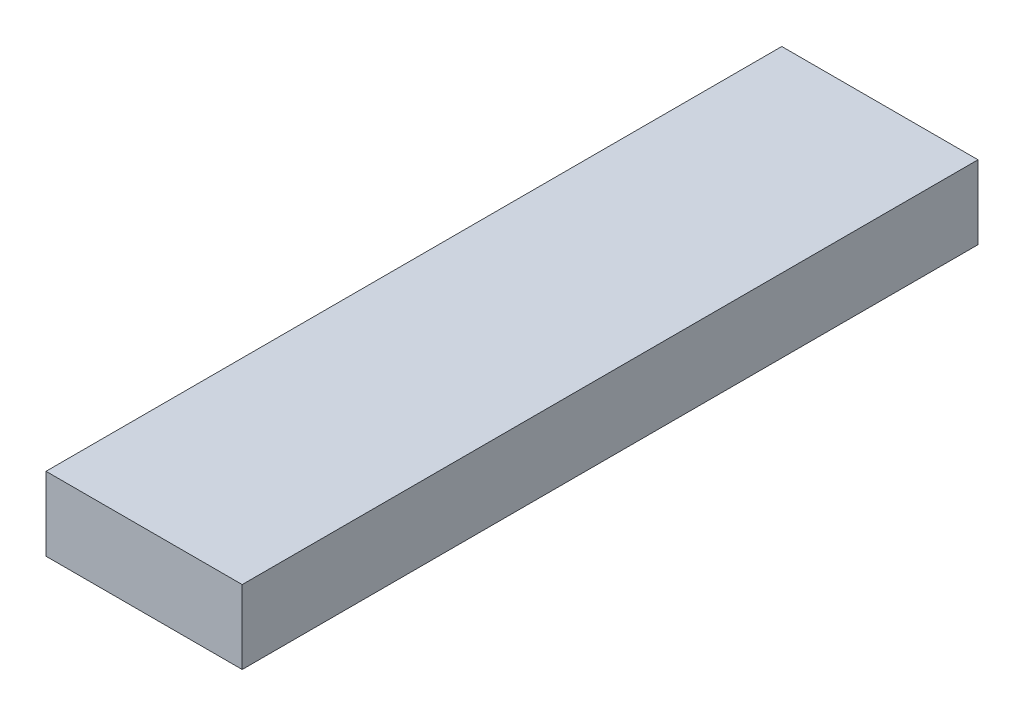
ISO-10303-21;
HEADER;
FILE_DESCRIPTION(('STEP AP214'),'2;1');
FILE_NAME('part.step','',(''),(''),'','','');
FILE_SCHEMA(('AUTOMOTIVE_DESIGN { 1 0 10303 214 1 1 1 1 }'));
ENDSEC;
DATA;
#1=APPLICATION_CONTEXT('core data for automotive mechanical design processes');
#2=APPLICATION_PROTOCOL_DEFINITION('international standard','automotive_design',2000,#1);
#3=PRODUCT_CONTEXT('',#1,'mechanical');
#4=PRODUCT('Part','Part','',(#3));
#5=PRODUCT_RELATED_PRODUCT_CATEGORY('part','',(#4));
#6=PRODUCT_DEFINITION_FORMATION('','',#4);
#7=PRODUCT_DEFINITION_CONTEXT('part definition',#1,'design');
#8=PRODUCT_DEFINITION('design','',#6,#7);
#9=PRODUCT_DEFINITION_SHAPE('','',#8);
#10=(LENGTH_UNIT() NAMED_UNIT(*) SI_UNIT(.MILLI.,.METRE.));
#11=(NAMED_UNIT(*) PLANE_ANGLE_UNIT() SI_UNIT($,.RADIAN.));
#12=(NAMED_UNIT(*) SI_UNIT($,.STERADIAN.) SOLID_ANGLE_UNIT());
#13=UNCERTAINTY_MEASURE_WITH_UNIT(LENGTH_MEASURE(1.E-05),#10,'distance_accuracy_value','');
#14=(GEOMETRIC_REPRESENTATION_CONTEXT(3) GLOBAL_UNCERTAINTY_ASSIGNED_CONTEXT((#13)) GLOBAL_UNIT_ASSIGNED_CONTEXT((#10,
#11,#12)) REPRESENTATION_CONTEXT('',''));
#15=CARTESIAN_POINT('',(0.,0.,0.));
#16=DIRECTION('',(0.,0.,1.));
#17=DIRECTION('',(1.,0.,0.));
#18=AXIS2_PLACEMENT_3D('',#15,#16,#17);
#19=CARTESIAN_POINT('',(0.,0.,95.25));
#20=DIRECTION('',(1.,0.,0.));
#21=DIRECTION('',(0.,0.,-1.));
#22=AXIS2_PLACEMENT_3D('',#19,#20,#21);
#23=PLANE('',#22);
#24=DIRECTION('',(0.,-1.,0.));
#25=VECTOR('',#24,1.);
#26=CARTESIAN_POINT('',(0.,0.,0.));
#27=LINE('',#26,#25);
#28=CARTESIAN_POINT('',(0.,9.525,0.));
#29=VERTEX_POINT('',#28);
#30=CARTESIAN_POINT('',(0.,0.,0.));
#31=VERTEX_POINT('',#30);
#32=EDGE_CURVE('E96',#29,#31,#27,.T.);
#33=ORIENTED_EDGE('',*,*,#32,.T.);
#34=DIRECTION('',(0.,0.,-1.));
#35=VECTOR('',#34,1.);
#36=CARTESIAN_POINT('',(0.,0.,95.25));
#37=LINE('',#36,#35);
#38=CARTESIAN_POINT('',(0.,0.,95.25));
#39=VERTEX_POINT('',#38);
#40=EDGE_CURVE('E11',#39,#31,#37,.T.);
#41=ORIENTED_EDGE('',*,*,#40,.F.);
#42=DIRECTION('',(0.,-1.,0.));
#43=VECTOR('',#42,1.);
#44=CARTESIAN_POINT('',(0.,0.,95.25));
#45=LINE('',#44,#43);
#46=CARTESIAN_POINT('',(0.,9.525,95.25));
#47=VERTEX_POINT('',#46);
#48=EDGE_CURVE('E84',#47,#39,#45,.T.);
#49=ORIENTED_EDGE('',*,*,#48,.F.);
#50=DIRECTION('',(0.,0.,-1.));
#51=VECTOR('',#50,1.);
#52=CARTESIAN_POINT('',(0.,9.525,95.25));
#53=LINE('',#52,#51);
#54=EDGE_CURVE('E92',#47,#29,#53,.T.);
#55=ORIENTED_EDGE('',*,*,#54,.T.);
#56=EDGE_LOOP('',(#33,#41,#49,#55));
#57=FACE_BOUND('',#56,.T.);
#58=ADVANCED_FACE('F33',(#57),#23,.F.);
#59=CARTESIAN_POINT('',(0.,0.,95.25));
#60=DIRECTION('',(0.,1.,0.));
#61=DIRECTION('',(0.,0.,1.));
#62=AXIS2_PLACEMENT_3D('',#59,#60,#61);
#63=PLANE('',#62);
#64=DIRECTION('',(1.,0.,0.));
#65=VECTOR('',#64,1.);
#66=CARTESIAN_POINT('',(0.,0.,0.));
#67=LINE('',#66,#65);
#68=CARTESIAN_POINT('',(25.4,0.,0.));
#69=VERTEX_POINT('',#68);
#70=EDGE_CURVE('E88',#31,#69,#67,.T.);
#71=ORIENTED_EDGE('',*,*,#70,.T.);
#72=DIRECTION('',(0.,0.,-1.));
#73=VECTOR('',#72,1.);
#74=CARTESIAN_POINT('',(25.4,0.,95.25));
#75=LINE('',#74,#73);
#76=CARTESIAN_POINT('',(25.4,0.,95.25));
#77=VERTEX_POINT('',#76);
#78=EDGE_CURVE('E41',#77,#69,#75,.T.);
#79=ORIENTED_EDGE('',*,*,#78,.F.);
#80=DIRECTION('',(1.,0.,0.));
#81=VECTOR('',#80,1.);
#82=CARTESIAN_POINT('',(0.,0.,95.25));
#83=LINE('',#82,#81);
#84=EDGE_CURVE('E79',#39,#77,#83,.T.);
#85=ORIENTED_EDGE('',*,*,#84,.F.);
#86=ORIENTED_EDGE('',*,*,#40,.T.);
#87=EDGE_LOOP('',(#71,#79,#85,#86));
#88=FACE_BOUND('',#87,.T.);
#89=ADVANCED_FACE('F87',(#88),#63,.F.);
#90=CARTESIAN_POINT('',(25.4,0.,95.25));
#91=DIRECTION('',(-1.,0.,0.));
#92=DIRECTION('',(0.,0.,1.));
#93=AXIS2_PLACEMENT_3D('',#90,#91,#92);
#94=PLANE('',#93);
#95=DIRECTION('',(0.,1.,0.));
#96=VECTOR('',#95,1.);
#97=CARTESIAN_POINT('',(25.4,0.,0.));
#98=LINE('',#97,#96);
#99=CARTESIAN_POINT('',(25.4,9.525,0.));
#100=VERTEX_POINT('',#99);
#101=EDGE_CURVE('E66',#69,#100,#98,.T.);
#102=ORIENTED_EDGE('',*,*,#101,.T.);
#103=DIRECTION('',(0.,0.,-1.));
#104=VECTOR('',#103,1.);
#105=CARTESIAN_POINT('',(25.4,9.525,95.25));
#106=LINE('',#105,#104);
#107=CARTESIAN_POINT('',(25.4,9.525,95.25));
#108=VERTEX_POINT('',#107);
#109=EDGE_CURVE('E89',#108,#100,#106,.T.);
#110=ORIENTED_EDGE('',*,*,#109,.F.);
#111=DIRECTION('',(0.,1.,0.));
#112=VECTOR('',#111,1.);
#113=CARTESIAN_POINT('',(25.4,0.,95.25));
#114=LINE('',#113,#112);
#115=EDGE_CURVE('E82',#77,#108,#114,.T.);
#116=ORIENTED_EDGE('',*,*,#115,.F.);
#117=ORIENTED_EDGE('',*,*,#78,.T.);
#118=EDGE_LOOP('',(#102,#110,#116,#117));
#119=FACE_BOUND('',#118,.T.);
#120=ADVANCED_FACE('F90',(#119),#94,.F.);
#121=CARTESIAN_POINT('',(0.,9.525,95.25));
#122=DIRECTION('',(0.,-1.,0.));
#123=DIRECTION('',(0.,0.,-1.));
#124=AXIS2_PLACEMENT_3D('',#121,#122,#123);
#125=PLANE('',#124);
#126=DIRECTION('',(-1.,0.,0.));
#127=VECTOR('',#126,1.);
#128=CARTESIAN_POINT('',(0.,9.525,0.));
#129=LINE('',#128,#127);
#130=EDGE_CURVE('E72',#100,#29,#129,.T.);
#131=ORIENTED_EDGE('',*,*,#130,.T.);
#132=ORIENTED_EDGE('',*,*,#54,.F.);
#133=DIRECTION('',(-1.,0.,0.));
#134=VECTOR('',#133,1.);
#135=CARTESIAN_POINT('',(0.,9.525,95.25));
#136=LINE('',#135,#134);
#137=EDGE_CURVE('E49',#108,#47,#136,.T.);
#138=ORIENTED_EDGE('',*,*,#137,.F.);
#139=ORIENTED_EDGE('',*,*,#109,.T.);
#140=EDGE_LOOP('',(#131,#132,#138,#139));
#141=FACE_BOUND('',#140,.T.);
#142=ADVANCED_FACE('F103',(#141),#125,.F.);
#143=CARTESIAN_POINT('',(0.,0.,95.25));
#144=DIRECTION('',(0.,0.,-1.));
#145=DIRECTION('',(-1.,0.,0.));
#146=AXIS2_PLACEMENT_3D('',#143,#144,#145);
#147=PLANE('',#146);
#148=ORIENTED_EDGE('',*,*,#48,.T.);
#149=ORIENTED_EDGE('',*,*,#84,.T.);
#150=ORIENTED_EDGE('',*,*,#115,.T.);
#151=ORIENTED_EDGE('',*,*,#137,.T.);
#152=EDGE_LOOP('',(#148,#149,#150,#151));
#153=FACE_BOUND('',#152,.T.);
#154=ADVANCED_FACE('F80',(#153),#147,.F.);
#155=CARTESIAN_POINT('',(0.,0.,0.));
#156=DIRECTION('',(0.,0.,-1.));
#157=DIRECTION('',(-1.,0.,0.));
#158=AXIS2_PLACEMENT_3D('',#155,#156,#157);
#159=PLANE('',#158);
#160=ORIENTED_EDGE('',*,*,#32,.F.);
#161=ORIENTED_EDGE('',*,*,#130,.F.);
#162=ORIENTED_EDGE('',*,*,#101,.F.);
#163=ORIENTED_EDGE('',*,*,#70,.F.);
#164=EDGE_LOOP('',(#160,#161,#162,#163));
#165=FACE_BOUND('',#164,.T.);
#166=ADVANCED_FACE('F106',(#165),#159,.T.);
#167=CLOSED_SHELL('',(#58,#89,#120,#142,#154,#166));
#168=MANIFOLD_SOLID_BREP('B2',#167);
#169=ADVANCED_BREP_SHAPE_REPRESENTATION('',(#18,#168),#14);
#170=SHAPE_DEFINITION_REPRESENTATION(#9,#169);
ENDSEC;
END-ISO-10303-21;
